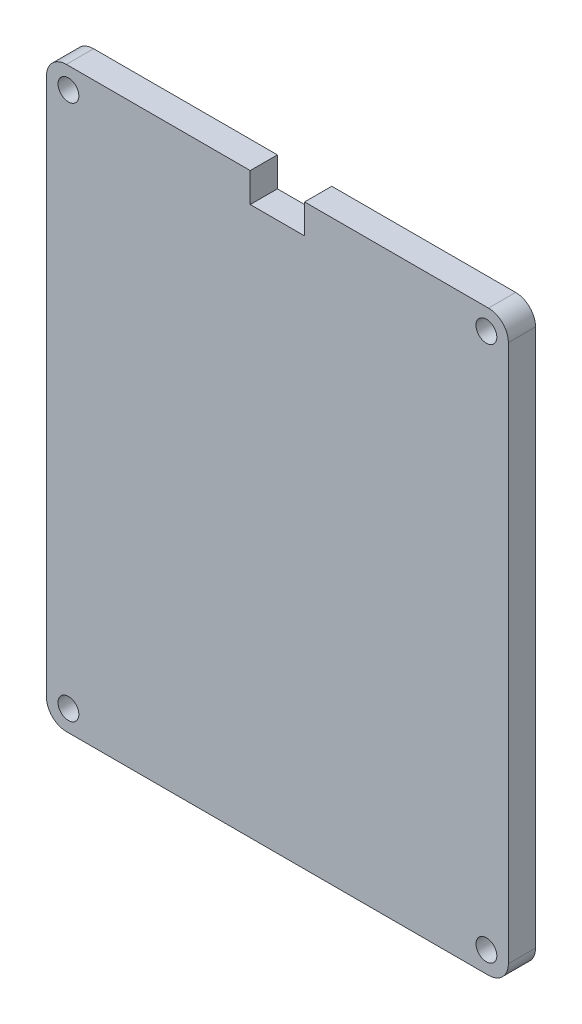
ISO-10303-21;
HEADER;
FILE_DESCRIPTION(('STEP AP214'),'2;1');
FILE_NAME('part.step','',(''),(''),'','','');
FILE_SCHEMA(('AUTOMOTIVE_DESIGN { 1 0 10303 214 1 1 1 1 }'));
ENDSEC;
DATA;
#1=APPLICATION_CONTEXT('core data for automotive mechanical design processes');
#2=APPLICATION_PROTOCOL_DEFINITION('international standard','automotive_design',2000,#1);
#3=PRODUCT_CONTEXT('',#1,'mechanical');
#4=PRODUCT('Part','Part','',(#3));
#5=PRODUCT_RELATED_PRODUCT_CATEGORY('part','',(#4));
#6=PRODUCT_DEFINITION_FORMATION('','',#4);
#7=PRODUCT_DEFINITION_CONTEXT('part definition',#1,'design');
#8=PRODUCT_DEFINITION('design','',#6,#7);
#9=PRODUCT_DEFINITION_SHAPE('','',#8);
#10=(LENGTH_UNIT() NAMED_UNIT(*) SI_UNIT(.MILLI.,.METRE.));
#11=(NAMED_UNIT(*) PLANE_ANGLE_UNIT() SI_UNIT($,.RADIAN.));
#12=(NAMED_UNIT(*) SI_UNIT($,.STERADIAN.) SOLID_ANGLE_UNIT());
#13=UNCERTAINTY_MEASURE_WITH_UNIT(LENGTH_MEASURE(1.E-05),#10,'distance_accuracy_value','');
#14=(GEOMETRIC_REPRESENTATION_CONTEXT(3) GLOBAL_UNCERTAINTY_ASSIGNED_CONTEXT((#13)) GLOBAL_UNIT_ASSIGNED_CONTEXT((#10,
#11,#12)) REPRESENTATION_CONTEXT('',''));
#15=CARTESIAN_POINT('',(0.,0.,0.));
#16=DIRECTION('',(0.,0.,1.));
#17=DIRECTION('',(1.,0.,0.));
#18=AXIS2_PLACEMENT_3D('',#15,#16,#17);
#19=CARTESIAN_POINT('',(23.075,-29.575,0.));
#20=DIRECTION('',(0.,0.,1.));
#21=DIRECTION('',(1.,0.,0.));
#22=AXIS2_PLACEMENT_3D('',#19,#20,#21);
#23=CYLINDRICAL_SURFACE('',#22,1.15);
#24=DIRECTION('',(0.,0.,-1.));
#25=VECTOR('',#24,1.);
#26=CARTESIAN_POINT('',(24.225,-29.575,0.));
#27=LINE('',#26,#25);
#28=CARTESIAN_POINT('',(24.225,-29.575,0.));
#29=VERTEX_POINT('',#28);
#30=CARTESIAN_POINT('',(24.225,-29.575,-3.));
#31=VERTEX_POINT('',#30);
#32=EDGE_CURVE('E11',#29,#31,#27,.T.);
#33=ORIENTED_EDGE('',*,*,#32,.T.);
#34=CARTESIAN_POINT('',(23.075,-29.575,-3.));
#35=DIRECTION('',(0.,0.,1.));
#36=DIRECTION('',(1.,0.,0.));
#37=AXIS2_PLACEMENT_3D('',#34,#35,#36);
#38=CIRCLE('',#37,1.15);
#39=EDGE_CURVE('E221',#31,#31,#38,.T.);
#40=ORIENTED_EDGE('',*,*,#39,.F.);
#41=ORIENTED_EDGE('',*,*,#32,.F.);
#42=CARTESIAN_POINT('',(23.075,-29.575,0.));
#43=DIRECTION('',(0.,0.,1.));
#44=DIRECTION('',(1.,0.,0.));
#45=AXIS2_PLACEMENT_3D('',#42,#43,#44);
#46=CIRCLE('',#45,1.15);
#47=EDGE_CURVE('E195',#29,#29,#46,.T.);
#48=ORIENTED_EDGE('',*,*,#47,.T.);
#49=EDGE_LOOP('',(#33,#40,#41,#48));
#50=FACE_BOUND('',#49,.T.);
#51=ADVANCED_FACE('F16',(#50),#23,.F.);
#52=CARTESIAN_POINT('',(23.075,29.575,0.));
#53=DIRECTION('',(0.,0.,1.));
#54=DIRECTION('',(1.,0.,0.));
#55=AXIS2_PLACEMENT_3D('',#52,#53,#54);
#56=CYLINDRICAL_SURFACE('',#55,1.15);
#57=DIRECTION('',(0.,0.,-1.));
#58=VECTOR('',#57,1.);
#59=CARTESIAN_POINT('',(24.225,29.575,0.));
#60=LINE('',#59,#58);
#61=CARTESIAN_POINT('',(24.225,29.575,0.));
#62=VERTEX_POINT('',#61);
#63=CARTESIAN_POINT('',(24.225,29.575,-3.));
#64=VERTEX_POINT('',#63);
#65=EDGE_CURVE('E26',#62,#64,#60,.T.);
#66=ORIENTED_EDGE('',*,*,#65,.T.);
#67=CARTESIAN_POINT('',(23.075,29.575,-3.));
#68=DIRECTION('',(0.,0.,1.));
#69=DIRECTION('',(1.,0.,0.));
#70=AXIS2_PLACEMENT_3D('',#67,#68,#69);
#71=CIRCLE('',#70,1.15);
#72=EDGE_CURVE('E206',#64,#64,#71,.T.);
#73=ORIENTED_EDGE('',*,*,#72,.F.);
#74=ORIENTED_EDGE('',*,*,#65,.F.);
#75=CARTESIAN_POINT('',(23.075,29.575,0.));
#76=DIRECTION('',(0.,0.,1.));
#77=DIRECTION('',(1.,0.,0.));
#78=AXIS2_PLACEMENT_3D('',#75,#76,#77);
#79=CIRCLE('',#78,1.15);
#80=EDGE_CURVE('E191',#62,#62,#79,.T.);
#81=ORIENTED_EDGE('',*,*,#80,.T.);
#82=EDGE_LOOP('',(#66,#73,#74,#81));
#83=FACE_BOUND('',#82,.T.);
#84=ADVANCED_FACE('F637',(#83),#56,.F.);
#85=CARTESIAN_POINT('',(-23.075,29.575,0.));
#86=DIRECTION('',(0.,0.,1.));
#87=DIRECTION('',(1.,0.,0.));
#88=AXIS2_PLACEMENT_3D('',#85,#86,#87);
#89=CYLINDRICAL_SURFACE('',#88,1.15);
#90=DIRECTION('',(0.,0.,-1.));
#91=VECTOR('',#90,1.);
#92=CARTESIAN_POINT('',(-21.925,29.575,0.));
#93=LINE('',#92,#91);
#94=CARTESIAN_POINT('',(-21.925,29.575,0.));
#95=VERTEX_POINT('',#94);
#96=CARTESIAN_POINT('',(-21.925,29.575,-3.));
#97=VERTEX_POINT('',#96);
#98=EDGE_CURVE('E235',#95,#97,#93,.T.);
#99=ORIENTED_EDGE('',*,*,#98,.T.);
#100=CARTESIAN_POINT('',(-23.075,29.575,-3.));
#101=DIRECTION('',(0.,0.,1.));
#102=DIRECTION('',(1.,0.,0.));
#103=AXIS2_PLACEMENT_3D('',#100,#101,#102);
#104=CIRCLE('',#103,1.15);
#105=EDGE_CURVE('E202',#97,#97,#104,.T.);
#106=ORIENTED_EDGE('',*,*,#105,.F.);
#107=ORIENTED_EDGE('',*,*,#98,.F.);
#108=CARTESIAN_POINT('',(-23.075,29.575,0.));
#109=DIRECTION('',(0.,0.,1.));
#110=DIRECTION('',(1.,0.,0.));
#111=AXIS2_PLACEMENT_3D('',#108,#109,#110);
#112=CIRCLE('',#111,1.15);
#113=EDGE_CURVE('E189',#95,#95,#112,.T.);
#114=ORIENTED_EDGE('',*,*,#113,.T.);
#115=EDGE_LOOP('',(#99,#106,#107,#114));
#116=FACE_BOUND('',#115,.T.);
#117=ADVANCED_FACE('F627',(#116),#89,.F.);
#118=CARTESIAN_POINT('',(-23.075,-29.575,0.));
#119=DIRECTION('',(0.,0.,1.));
#120=DIRECTION('',(1.,0.,0.));
#121=AXIS2_PLACEMENT_3D('',#118,#119,#120);
#122=CYLINDRICAL_SURFACE('',#121,1.15);
#123=DIRECTION('',(0.,0.,-1.));
#124=VECTOR('',#123,1.);
#125=CARTESIAN_POINT('',(-21.925,-29.575,0.));
#126=LINE('',#125,#124);
#127=CARTESIAN_POINT('',(-21.925,-29.575,0.));
#128=VERTEX_POINT('',#127);
#129=CARTESIAN_POINT('',(-21.925,-29.575,-3.));
#130=VERTEX_POINT('',#129);
#131=EDGE_CURVE('E239',#128,#130,#126,.T.);
#132=ORIENTED_EDGE('',*,*,#131,.T.);
#133=CARTESIAN_POINT('',(-23.075,-29.575,-3.));
#134=DIRECTION('',(0.,0.,1.));
#135=DIRECTION('',(1.,0.,0.));
#136=AXIS2_PLACEMENT_3D('',#133,#134,#135);
#137=CIRCLE('',#136,1.15);
#138=EDGE_CURVE('E207',#130,#130,#137,.T.);
#139=ORIENTED_EDGE('',*,*,#138,.F.);
#140=ORIENTED_EDGE('',*,*,#131,.F.);
#141=CARTESIAN_POINT('',(-23.075,-29.575,0.));
#142=DIRECTION('',(0.,0.,1.));
#143=DIRECTION('',(1.,0.,0.));
#144=AXIS2_PLACEMENT_3D('',#141,#142,#143);
#145=CIRCLE('',#144,1.15);
#146=EDGE_CURVE('E185',#128,#128,#145,.T.);
#147=ORIENTED_EDGE('',*,*,#146,.T.);
#148=EDGE_LOOP('',(#132,#139,#140,#147));
#149=FACE_BOUND('',#148,.T.);
#150=ADVANCED_FACE('F617',(#149),#122,.F.);
#151=CARTESIAN_POINT('',(-25.5,31.9,0.));
#152=DIRECTION('',(0.,-1.,0.));
#153=DIRECTION('',(0.,0.,-1.));
#154=AXIS2_PLACEMENT_3D('',#151,#152,#153);
#155=PLANE('',#154);
#156=DIRECTION('',(0.,0.,-1.));
#157=VECTOR('',#156,1.);
#158=CARTESIAN_POINT('',(-3.,31.9,0.));
#159=LINE('',#158,#157);
#160=CARTESIAN_POINT('',(-3.,31.9,0.));
#161=VERTEX_POINT('',#160);
#162=CARTESIAN_POINT('',(-3.,31.9,-3.));
#163=VERTEX_POINT('',#162);
#164=EDGE_CURVE('E150',#161,#163,#159,.T.);
#165=ORIENTED_EDGE('',*,*,#164,.T.);
#166=DIRECTION('',(1.,0.,0.));
#167=VECTOR('',#166,1.);
#168=CARTESIAN_POINT('',(-25.5,31.9,-3.));
#169=LINE('',#168,#167);
#170=CARTESIAN_POINT('',(-23.3,31.9,-3.));
#171=VERTEX_POINT('',#170);
#172=EDGE_CURVE('E196',#171,#163,#169,.T.);
#173=ORIENTED_EDGE('',*,*,#172,.F.);
#174=DIRECTION('',(0.,0.,-1.));
#175=VECTOR('',#174,1.);
#176=CARTESIAN_POINT('',(-23.3,31.9,0.));
#177=LINE('',#176,#175);
#178=CARTESIAN_POINT('',(-23.3,31.9,0.));
#179=VERTEX_POINT('',#178);
#180=EDGE_CURVE('E215',#179,#171,#177,.T.);
#181=ORIENTED_EDGE('',*,*,#180,.F.);
#182=DIRECTION('',(1.,0.,0.));
#183=VECTOR('',#182,1.);
#184=CARTESIAN_POINT('',(-25.5,31.9,0.));
#185=LINE('',#184,#183);
#186=EDGE_CURVE('E155',#179,#161,#185,.T.);
#187=ORIENTED_EDGE('',*,*,#186,.T.);
#188=EDGE_LOOP('',(#165,#173,#181,#187));
#189=FACE_BOUND('',#188,.T.);
#190=ADVANCED_FACE('F607',(#189),#155,.F.);
#191=CARTESIAN_POINT('',(-23.3,29.7,0.));
#192=DIRECTION('',(0.,0.,-1.));
#193=DIRECTION('',(-1.,0.,0.));
#194=AXIS2_PLACEMENT_3D('',#191,#192,#193);
#195=CYLINDRICAL_SURFACE('',#194,2.2);
#196=CARTESIAN_POINT('',(-23.3,29.7,0.));
#197=DIRECTION('',(0.,0.,-1.));
#198=DIRECTION('',(0.,1.,0.));
#199=AXIS2_PLACEMENT_3D('',#196,#197,#198);
#200=CIRCLE('',#199,2.2);
#201=CARTESIAN_POINT('',(-25.5,29.7,0.));
#202=VERTEX_POINT('',#201);
#203=EDGE_CURVE('E261',#202,#179,#200,.T.);
#204=ORIENTED_EDGE('',*,*,#203,.T.);
#205=ORIENTED_EDGE('',*,*,#180,.T.);
#206=CARTESIAN_POINT('',(-23.3,29.7,-3.));
#207=DIRECTION('',(0.,0.,-1.));
#208=DIRECTION('',(0.,1.,0.));
#209=AXIS2_PLACEMENT_3D('',#206,#207,#208);
#210=CIRCLE('',#209,2.2);
#211=CARTESIAN_POINT('',(-25.5,29.7,-3.));
#212=VERTEX_POINT('',#211);
#213=EDGE_CURVE('E201',#212,#171,#210,.T.);
#214=ORIENTED_EDGE('',*,*,#213,.F.);
#215=DIRECTION('',(0.,0.,-1.));
#216=VECTOR('',#215,1.);
#217=CARTESIAN_POINT('',(-25.5,29.7,0.));
#218=LINE('',#217,#216);
#219=EDGE_CURVE('E143',#202,#212,#218,.T.);
#220=ORIENTED_EDGE('',*,*,#219,.F.);
#221=EDGE_LOOP('',(#204,#205,#214,#220));
#222=FACE_BOUND('',#221,.T.);
#223=ADVANCED_FACE('F598',(#222),#195,.T.);
#224=CARTESIAN_POINT('',(-3.,31.9,0.));
#225=DIRECTION('',(-1.,0.,0.));
#226=DIRECTION('',(0.,0.,1.));
#227=AXIS2_PLACEMENT_3D('',#224,#225,#226);
#228=PLANE('',#227);
#229=DIRECTION('',(0.,-1.,0.));
#230=VECTOR('',#229,1.);
#231=CARTESIAN_POINT('',(-3.,31.9,0.));
#232=LINE('',#231,#230);
#233=CARTESIAN_POINT('',(-3.,28.65,0.));
#234=VERTEX_POINT('',#233);
#235=EDGE_CURVE('E147',#161,#234,#232,.T.);
#236=ORIENTED_EDGE('',*,*,#235,.T.);
#237=DIRECTION('',(0.,0.,-1.));
#238=VECTOR('',#237,1.);
#239=CARTESIAN_POINT('',(-3.,28.65,0.));
#240=LINE('',#239,#238);
#241=CARTESIAN_POINT('',(-3.,28.65,-3.));
#242=VERTEX_POINT('',#241);
#243=EDGE_CURVE('E130',#234,#242,#240,.T.);
#244=ORIENTED_EDGE('',*,*,#243,.T.);
#245=DIRECTION('',(0.,-1.,0.));
#246=VECTOR('',#245,1.);
#247=CARTESIAN_POINT('',(-3.,31.9,-3.));
#248=LINE('',#247,#246);
#249=EDGE_CURVE('E200',#163,#242,#248,.T.);
#250=ORIENTED_EDGE('',*,*,#249,.F.);
#251=ORIENTED_EDGE('',*,*,#164,.F.);
#252=EDGE_LOOP('',(#236,#244,#250,#251));
#253=FACE_BOUND('',#252,.T.);
#254=ADVANCED_FACE('F148',(#253),#228,.F.);
#255=CARTESIAN_POINT('',(-25.5,-31.9,0.));
#256=DIRECTION('',(1.,0.,0.));
#257=DIRECTION('',(0.,1.,0.));
#258=AXIS2_PLACEMENT_3D('',#255,#256,#257);
#259=PLANE('',#258);
#260=ORIENTED_EDGE('',*,*,#219,.T.);
#261=DIRECTION('',(0.,1.,0.));
#262=VECTOR('',#261,1.);
#263=CARTESIAN_POINT('',(-25.5,-31.9,-3.));
#264=LINE('',#263,#262);
#265=CARTESIAN_POINT('',(-25.5,-29.7,-3.));
#266=VERTEX_POINT('',#265);
#267=EDGE_CURVE('E212',#266,#212,#264,.T.);
#268=ORIENTED_EDGE('',*,*,#267,.F.);
#269=DIRECTION('',(0.,0.,-1.));
#270=VECTOR('',#269,1.);
#271=CARTESIAN_POINT('',(-25.5,-29.7,0.));
#272=LINE('',#271,#270);
#273=CARTESIAN_POINT('',(-25.5,-29.7,0.));
#274=VERTEX_POINT('',#273);
#275=EDGE_CURVE('E144',#274,#266,#272,.T.);
#276=ORIENTED_EDGE('',*,*,#275,.F.);
#277=DIRECTION('',(0.,1.,0.));
#278=VECTOR('',#277,1.);
#279=CARTESIAN_POINT('',(-25.5,-31.9,0.));
#280=LINE('',#279,#278);
#281=EDGE_CURVE('E176',#274,#202,#280,.T.);
#282=ORIENTED_EDGE('',*,*,#281,.T.);
#283=EDGE_LOOP('',(#260,#268,#276,#282));
#284=FACE_BOUND('',#283,.T.);
#285=ADVANCED_FACE('F579',(#284),#259,.F.);
#286=CARTESIAN_POINT('',(-3.,28.65,0.));
#287=DIRECTION('',(0.,-1.,0.));
#288=DIRECTION('',(0.,0.,-1.));
#289=AXIS2_PLACEMENT_3D('',#286,#287,#288);
#290=PLANE('',#289);
#291=DIRECTION('',(1.,0.,0.));
#292=VECTOR('',#291,1.);
#293=CARTESIAN_POINT('',(-3.,28.65,0.));
#294=LINE('',#293,#292);
#295=CARTESIAN_POINT('',(3.,28.65,0.));
#296=VERTEX_POINT('',#295);
#297=EDGE_CURVE('E135',#234,#296,#294,.T.);
#298=ORIENTED_EDGE('',*,*,#297,.T.);
#299=DIRECTION('',(0.,0.,-1.));
#300=VECTOR('',#299,1.);
#301=CARTESIAN_POINT('',(3.,28.65,0.));
#302=LINE('',#301,#300);
#303=CARTESIAN_POINT('',(3.,28.65,-3.));
#304=VERTEX_POINT('',#303);
#305=EDGE_CURVE('E19',#296,#304,#302,.T.);
#306=ORIENTED_EDGE('',*,*,#305,.T.);
#307=DIRECTION('',(1.,0.,0.));
#308=VECTOR('',#307,1.);
#309=CARTESIAN_POINT('',(-3.,28.65,-3.));
#310=LINE('',#309,#308);
#311=EDGE_CURVE('E138',#242,#304,#310,.T.);
#312=ORIENTED_EDGE('',*,*,#311,.F.);
#313=ORIENTED_EDGE('',*,*,#243,.F.);
#314=EDGE_LOOP('',(#298,#306,#312,#313));
#315=FACE_BOUND('',#314,.T.);
#316=ADVANCED_FACE('F132',(#315),#290,.F.);
#317=CARTESIAN_POINT('',(-23.3,-29.7,0.));
#318=DIRECTION('',(0.,0.,-1.));
#319=DIRECTION('',(0.,-1.,0.));
#320=AXIS2_PLACEMENT_3D('',#317,#318,#319);
#321=CYLINDRICAL_SURFACE('',#320,2.2);
#322=CARTESIAN_POINT('',(-23.3,-29.7,0.));
#323=DIRECTION('',(0.,0.,-1.));
#324=DIRECTION('',(0.,1.,0.));
#325=AXIS2_PLACEMENT_3D('',#322,#323,#324);
#326=CIRCLE('',#325,2.2);
#327=CARTESIAN_POINT('',(-23.3,-31.9,0.));
#328=VERTEX_POINT('',#327);
#329=EDGE_CURVE('E171',#328,#274,#326,.T.);
#330=ORIENTED_EDGE('',*,*,#329,.T.);
#331=ORIENTED_EDGE('',*,*,#275,.T.);
#332=CARTESIAN_POINT('',(-23.3,-29.7,-3.));
#333=DIRECTION('',(0.,0.,-1.));
#334=DIRECTION('',(0.,1.,0.));
#335=AXIS2_PLACEMENT_3D('',#332,#333,#334);
#336=CIRCLE('',#335,2.2);
#337=CARTESIAN_POINT('',(-23.3,-31.9,-3.));
#338=VERTEX_POINT('',#337);
#339=EDGE_CURVE('E208',#338,#266,#336,.T.);
#340=ORIENTED_EDGE('',*,*,#339,.F.);
#341=DIRECTION('',(0.,0.,-1.));
#342=VECTOR('',#341,1.);
#343=CARTESIAN_POINT('',(-23.3,-31.9,0.));
#344=LINE('',#343,#342);
#345=EDGE_CURVE('E250',#328,#338,#344,.T.);
#346=ORIENTED_EDGE('',*,*,#345,.F.);
#347=EDGE_LOOP('',(#330,#331,#340,#346));
#348=FACE_BOUND('',#347,.T.);
#349=ADVANCED_FACE('F560',(#348),#321,.T.);
#350=CARTESIAN_POINT('',(3.,31.9,0.));
#351=DIRECTION('',(-1.,0.,0.));
#352=DIRECTION('',(0.,0.,1.));
#353=AXIS2_PLACEMENT_3D('',#350,#351,#352);
#354=PLANE('',#353);
#355=DIRECTION('',(0.,0.,-1.));
#356=VECTOR('',#355,1.);
#357=CARTESIAN_POINT('',(3.,31.9,0.));
#358=LINE('',#357,#356);
#359=CARTESIAN_POINT('',(3.,31.9,0.));
#360=VERTEX_POINT('',#359);
#361=CARTESIAN_POINT('',(3.,31.9,-3.));
#362=VERTEX_POINT('',#361);
#363=EDGE_CURVE('E224',#360,#362,#358,.T.);
#364=ORIENTED_EDGE('',*,*,#363,.T.);
#365=DIRECTION('',(0.,-1.,0.));
#366=VECTOR('',#365,1.);
#367=CARTESIAN_POINT('',(3.,31.9,-3.));
#368=LINE('',#367,#366);
#369=EDGE_CURVE('E243',#362,#304,#368,.T.);
#370=ORIENTED_EDGE('',*,*,#369,.T.);
#371=ORIENTED_EDGE('',*,*,#305,.F.);
#372=DIRECTION('',(0.,-1.,0.));
#373=VECTOR('',#372,1.);
#374=CARTESIAN_POINT('',(3.,31.9,0.));
#375=LINE('',#374,#373);
#376=EDGE_CURVE('E161',#360,#296,#375,.T.);
#377=ORIENTED_EDGE('',*,*,#376,.F.);
#378=EDGE_LOOP('',(#364,#370,#371,#377));
#379=FACE_BOUND('',#378,.T.);
#380=ADVANCED_FACE('F332',(#379),#354,.T.);
#381=CARTESIAN_POINT('',(25.5,-31.9,0.));
#382=DIRECTION('',(0.,1.,0.));
#383=DIRECTION('',(1.,0.,0.));
#384=AXIS2_PLACEMENT_3D('',#381,#382,#383);
#385=PLANE('',#384);
#386=ORIENTED_EDGE('',*,*,#345,.T.);
#387=DIRECTION('',(-1.,0.,0.));
#388=VECTOR('',#387,1.);
#389=CARTESIAN_POINT('',(25.5,-31.9,-3.));
#390=LINE('',#389,#388);
#391=CARTESIAN_POINT('',(23.3,-31.9,-3.));
#392=VERTEX_POINT('',#391);
#393=EDGE_CURVE('E213',#392,#338,#390,.T.);
#394=ORIENTED_EDGE('',*,*,#393,.F.);
#395=DIRECTION('',(0.,0.,-1.));
#396=VECTOR('',#395,1.);
#397=CARTESIAN_POINT('',(23.3,-31.9,0.));
#398=LINE('',#397,#396);
#399=CARTESIAN_POINT('',(23.3,-31.9,0.));
#400=VERTEX_POINT('',#399);
#401=EDGE_CURVE('E229',#400,#392,#398,.T.);
#402=ORIENTED_EDGE('',*,*,#401,.F.);
#403=DIRECTION('',(-1.,0.,0.));
#404=VECTOR('',#403,1.);
#405=CARTESIAN_POINT('',(25.5,-31.9,0.));
#406=LINE('',#405,#404);
#407=EDGE_CURVE('E175',#400,#328,#406,.T.);
#408=ORIENTED_EDGE('',*,*,#407,.T.);
#409=EDGE_LOOP('',(#386,#394,#402,#408));
#410=FACE_BOUND('',#409,.T.);
#411=ADVANCED_FACE('F541',(#410),#385,.F.);
#412=CARTESIAN_POINT('',(25.5,31.9,0.));
#413=DIRECTION('',(0.,1.,0.));
#414=DIRECTION('',(1.,0.,0.));
#415=AXIS2_PLACEMENT_3D('',#412,#413,#414);
#416=PLANE('',#415);
#417=DIRECTION('',(-1.,0.,0.));
#418=VECTOR('',#417,1.);
#419=CARTESIAN_POINT('',(25.5,31.9,0.));
#420=LINE('',#419,#418);
#421=CARTESIAN_POINT('',(23.3,31.9,0.));
#422=VERTEX_POINT('',#421);
#423=EDGE_CURVE('E168',#422,#360,#420,.T.);
#424=ORIENTED_EDGE('',*,*,#423,.F.);
#425=DIRECTION('',(0.,0.,-1.));
#426=VECTOR('',#425,1.);
#427=CARTESIAN_POINT('',(23.3,31.9,0.));
#428=LINE('',#427,#426);
#429=CARTESIAN_POINT('',(23.3,31.9,-3.));
#430=VERTEX_POINT('',#429);
#431=EDGE_CURVE('E234',#422,#430,#428,.T.);
#432=ORIENTED_EDGE('',*,*,#431,.T.);
#433=DIRECTION('',(-1.,0.,0.));
#434=VECTOR('',#433,1.);
#435=CARTESIAN_POINT('',(25.5,31.9,-3.));
#436=LINE('',#435,#434);
#437=EDGE_CURVE('E220',#430,#362,#436,.T.);
#438=ORIENTED_EDGE('',*,*,#437,.T.);
#439=ORIENTED_EDGE('',*,*,#363,.F.);
#440=EDGE_LOOP('',(#424,#432,#438,#439));
#441=FACE_BOUND('',#440,.T.);
#442=ADVANCED_FACE('F328',(#441),#416,.T.);
#443=CARTESIAN_POINT('',(0.,0.750900042355,-3.));
#444=DIRECTION('',(0.,0.,-1.));
#445=DIRECTION('',(0.,-1.,0.));
#446=AXIS2_PLACEMENT_3D('',#443,#444,#445);
#447=PLANE('',#446);
#448=ORIENTED_EDGE('',*,*,#39,.T.);
#449=EDGE_LOOP('',(#448));
#450=FACE_BOUND('',#449,.T.);
#451=ORIENTED_EDGE('',*,*,#72,.T.);
#452=EDGE_LOOP('',(#451));
#453=FACE_BOUND('',#452,.T.);
#454=ORIENTED_EDGE('',*,*,#105,.T.);
#455=EDGE_LOOP('',(#454));
#456=FACE_BOUND('',#455,.T.);
#457=ORIENTED_EDGE('',*,*,#138,.T.);
#458=EDGE_LOOP('',(#457));
#459=FACE_BOUND('',#458,.T.);
#460=DIRECTION('',(0.,-1.,0.));
#461=VECTOR('',#460,1.);
#462=CARTESIAN_POINT('',(25.5,31.9,-3.));
#463=LINE('',#462,#461);
#464=CARTESIAN_POINT('',(25.5,29.7,-3.));
#465=VERTEX_POINT('',#464);
#466=CARTESIAN_POINT('',(25.5,-29.7,-3.));
#467=VERTEX_POINT('',#466);
#468=EDGE_CURVE('E228',#465,#467,#463,.T.);
#469=ORIENTED_EDGE('',*,*,#468,.T.);
#470=CARTESIAN_POINT('',(23.3,-29.7,-3.));
#471=DIRECTION('',(0.,0.,-1.));
#472=DIRECTION('',(0.,1.,0.));
#473=AXIS2_PLACEMENT_3D('',#470,#471,#472);
#474=CIRCLE('',#473,2.2);
#475=EDGE_CURVE('E233',#467,#392,#474,.T.);
#476=ORIENTED_EDGE('',*,*,#475,.T.);
#477=ORIENTED_EDGE('',*,*,#393,.T.);
#478=ORIENTED_EDGE('',*,*,#339,.T.);
#479=ORIENTED_EDGE('',*,*,#267,.T.);
#480=ORIENTED_EDGE('',*,*,#213,.T.);
#481=ORIENTED_EDGE('',*,*,#172,.T.);
#482=ORIENTED_EDGE('',*,*,#249,.T.);
#483=ORIENTED_EDGE('',*,*,#311,.T.);
#484=ORIENTED_EDGE('',*,*,#369,.F.);
#485=ORIENTED_EDGE('',*,*,#437,.F.);
#486=CARTESIAN_POINT('',(23.3,29.7,-3.));
#487=DIRECTION('',(0.,0.,1.));
#488=DIRECTION('',(0.,1.,0.));
#489=AXIS2_PLACEMENT_3D('',#486,#487,#488);
#490=CIRCLE('',#489,2.2);
#491=EDGE_CURVE('E251',#465,#430,#490,.T.);
#492=ORIENTED_EDGE('',*,*,#491,.F.);
#493=EDGE_LOOP('',(#469,#476,#477,#478,#479,#480,#481,#482,#483,#484,#485,#492));
#494=FACE_BOUND('',#493,.T.);
#495=ADVANCED_FACE('F520',(#450,#453,#456,#459,#494),#447,.T.);
#496=CARTESIAN_POINT('',(23.3,-29.7,0.));
#497=DIRECTION('',(0.,0.,-1.));
#498=DIRECTION('',(1.,0.,0.));
#499=AXIS2_PLACEMENT_3D('',#496,#497,#498);
#500=CYLINDRICAL_SURFACE('',#499,2.2);
#501=CARTESIAN_POINT('',(23.3,-29.7,0.));
#502=DIRECTION('',(0.,0.,-1.));
#503=DIRECTION('',(0.,1.,0.));
#504=AXIS2_PLACEMENT_3D('',#501,#502,#503);
#505=CIRCLE('',#504,2.2);
#506=CARTESIAN_POINT('',(25.5,-29.7,0.));
#507=VERTEX_POINT('',#506);
#508=EDGE_CURVE('E190',#507,#400,#505,.T.);
#509=ORIENTED_EDGE('',*,*,#508,.T.);
#510=ORIENTED_EDGE('',*,*,#401,.T.);
#511=ORIENTED_EDGE('',*,*,#475,.F.);
#512=DIRECTION('',(0.,0.,-1.));
#513=VECTOR('',#512,1.);
#514=CARTESIAN_POINT('',(25.5,-29.7,0.));
#515=LINE('',#514,#513);
#516=EDGE_CURVE('E265',#507,#467,#515,.T.);
#517=ORIENTED_EDGE('',*,*,#516,.F.);
#518=EDGE_LOOP('',(#509,#510,#511,#517));
#519=FACE_BOUND('',#518,.T.);
#520=ADVANCED_FACE('F508',(#519),#500,.T.);
#521=CARTESIAN_POINT('',(23.3,29.7,0.));
#522=DIRECTION('',(0.,0.,-1.));
#523=DIRECTION('',(1.,0.,0.));
#524=AXIS2_PLACEMENT_3D('',#521,#522,#523);
#525=CYLINDRICAL_SURFACE('',#524,2.2);
#526=DIRECTION('',(0.,0.,-1.));
#527=VECTOR('',#526,1.);
#528=CARTESIAN_POINT('',(25.5,29.7,0.));
#529=LINE('',#528,#527);
#530=CARTESIAN_POINT('',(25.5,29.7,0.));
#531=VERTEX_POINT('',#530);
#532=EDGE_CURVE('E184',#531,#465,#529,.T.);
#533=ORIENTED_EDGE('',*,*,#532,.T.);
#534=ORIENTED_EDGE('',*,*,#491,.T.);
#535=ORIENTED_EDGE('',*,*,#431,.F.);
#536=CARTESIAN_POINT('',(23.3,29.7,0.));
#537=DIRECTION('',(0.,0.,1.));
#538=DIRECTION('',(0.,1.,0.));
#539=AXIS2_PLACEMENT_3D('',#536,#537,#538);
#540=CIRCLE('',#539,2.2);
#541=EDGE_CURVE('E179',#531,#422,#540,.T.);
#542=ORIENTED_EDGE('',*,*,#541,.F.);
#543=EDGE_LOOP('',(#533,#534,#535,#542));
#544=FACE_BOUND('',#543,.T.);
#545=ADVANCED_FACE('F325',(#544),#525,.T.);
#546=CARTESIAN_POINT('',(0.,0.750900042355,0.));
#547=DIRECTION('',(0.,0.,-1.));
#548=DIRECTION('',(0.,-1.,0.));
#549=AXIS2_PLACEMENT_3D('',#546,#547,#548);
#550=PLANE('',#549);
#551=ORIENTED_EDGE('',*,*,#47,.F.);
#552=EDGE_LOOP('',(#551));
#553=FACE_BOUND('',#552,.T.);
#554=ORIENTED_EDGE('',*,*,#80,.F.);
#555=EDGE_LOOP('',(#554));
#556=FACE_BOUND('',#555,.T.);
#557=ORIENTED_EDGE('',*,*,#113,.F.);
#558=EDGE_LOOP('',(#557));
#559=FACE_BOUND('',#558,.T.);
#560=ORIENTED_EDGE('',*,*,#146,.F.);
#561=EDGE_LOOP('',(#560));
#562=FACE_BOUND('',#561,.T.);
#563=ORIENTED_EDGE('',*,*,#541,.T.);
#564=ORIENTED_EDGE('',*,*,#423,.T.);
#565=ORIENTED_EDGE('',*,*,#376,.T.);
#566=ORIENTED_EDGE('',*,*,#297,.F.);
#567=ORIENTED_EDGE('',*,*,#235,.F.);
#568=ORIENTED_EDGE('',*,*,#186,.F.);
#569=ORIENTED_EDGE('',*,*,#203,.F.);
#570=ORIENTED_EDGE('',*,*,#281,.F.);
#571=ORIENTED_EDGE('',*,*,#329,.F.);
#572=ORIENTED_EDGE('',*,*,#407,.F.);
#573=ORIENTED_EDGE('',*,*,#508,.F.);
#574=DIRECTION('',(0.,-1.,0.));
#575=VECTOR('',#574,1.);
#576=CARTESIAN_POINT('',(25.5,31.9,0.));
#577=LINE('',#576,#575);
#578=EDGE_CURVE('E180',#531,#507,#577,.T.);
#579=ORIENTED_EDGE('',*,*,#578,.F.);
#580=EDGE_LOOP('',(#563,#564,#565,#566,#567,#568,#569,#570,#571,#572,#573,#579));
#581=FACE_BOUND('',#580,.T.);
#582=ADVANCED_FACE('F158',(#553,#556,#559,#562,#581),#550,.F.);
#583=CARTESIAN_POINT('',(25.5,31.9,0.));
#584=DIRECTION('',(-1.,0.,0.));
#585=DIRECTION('',(0.,0.,1.));
#586=AXIS2_PLACEMENT_3D('',#583,#584,#585);
#587=PLANE('',#586);
#588=ORIENTED_EDGE('',*,*,#516,.T.);
#589=ORIENTED_EDGE('',*,*,#468,.F.);
#590=ORIENTED_EDGE('',*,*,#532,.F.);
#591=ORIENTED_EDGE('',*,*,#578,.T.);
#592=EDGE_LOOP('',(#588,#589,#590,#591));
#593=FACE_BOUND('',#592,.T.);
#594=ADVANCED_FACE('F473',(#593),#587,.F.);
#595=CLOSED_SHELL('',(#51,#84,#117,#150,#190,#223,#254,#285,#316,#349,#380,#411,#442,#495,#520,
#545,#582,#594));
#596=MANIFOLD_SOLID_BREP('B1',#595);
#597=ADVANCED_BREP_SHAPE_REPRESENTATION('',(#18,#596),#14);
#598=SHAPE_DEFINITION_REPRESENTATION(#9,#597);
ENDSEC;
END-ISO-10303-21;
